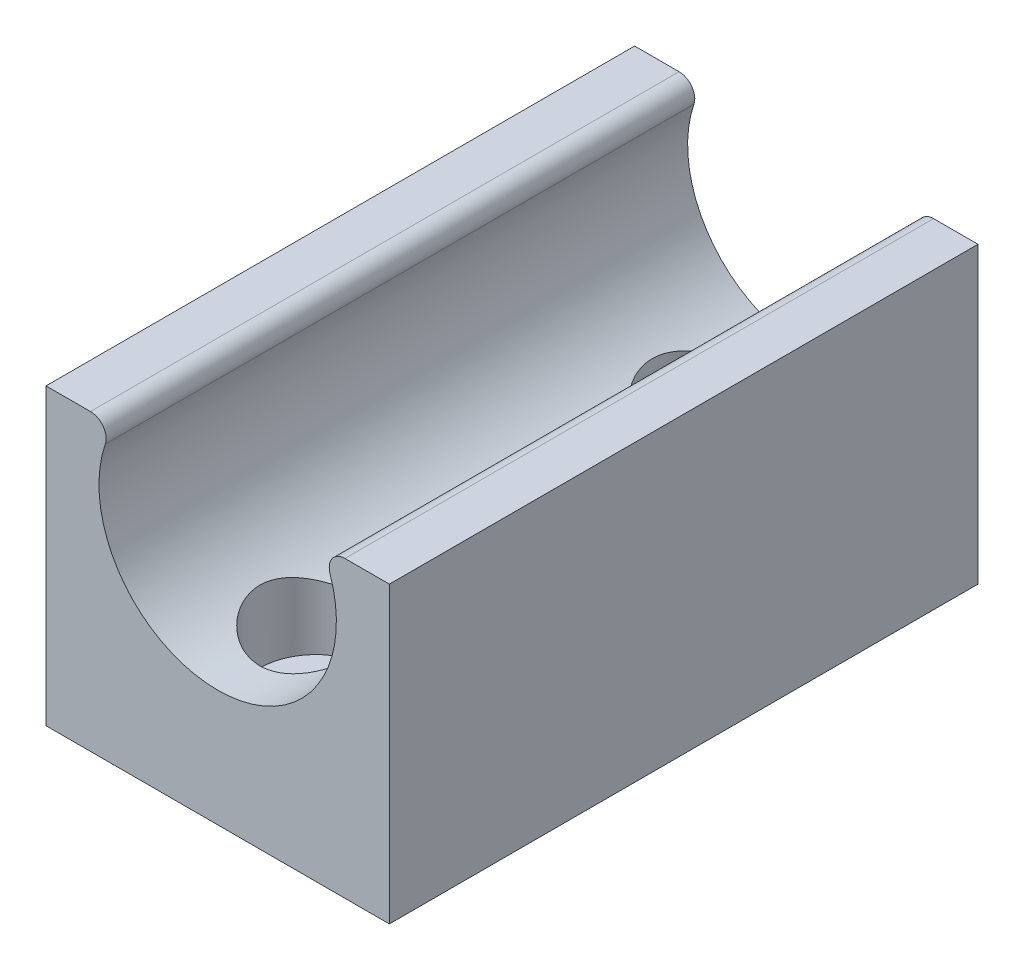
ISO-10303-21;
HEADER;
FILE_DESCRIPTION(('STEP AP214'),'2;1');
FILE_NAME('part.step','',(''),(''),'','','');
FILE_SCHEMA(('AUTOMOTIVE_DESIGN { 1 0 10303 214 1 1 1 1 }'));
ENDSEC;
DATA;
#1=APPLICATION_CONTEXT('core data for automotive mechanical design processes');
#2=APPLICATION_PROTOCOL_DEFINITION('international standard','automotive_design',2000,#1);
#3=PRODUCT_CONTEXT('',#1,'mechanical');
#4=PRODUCT('Part','Part','',(#3));
#5=PRODUCT_RELATED_PRODUCT_CATEGORY('part','',(#4));
#6=PRODUCT_DEFINITION_FORMATION('','',#4);
#7=PRODUCT_DEFINITION_CONTEXT('part definition',#1,'design');
#8=PRODUCT_DEFINITION('design','',#6,#7);
#9=PRODUCT_DEFINITION_SHAPE('','',#8);
#10=(LENGTH_UNIT() NAMED_UNIT(*) SI_UNIT(.MILLI.,.METRE.));
#11=(NAMED_UNIT(*) PLANE_ANGLE_UNIT() SI_UNIT($,.RADIAN.));
#12=(NAMED_UNIT(*) SI_UNIT($,.STERADIAN.) SOLID_ANGLE_UNIT());
#13=UNCERTAINTY_MEASURE_WITH_UNIT(LENGTH_MEASURE(1.E-05),#10,'distance_accuracy_value','');
#14=(GEOMETRIC_REPRESENTATION_CONTEXT(3) GLOBAL_UNCERTAINTY_ASSIGNED_CONTEXT((#13)) GLOBAL_UNIT_ASSIGNED_CONTEXT((#10,
#11,#12)) REPRESENTATION_CONTEXT('',''));
#15=CARTESIAN_POINT('',(0.,0.,0.));
#16=DIRECTION('',(0.,0.,1.));
#17=DIRECTION('',(1.,0.,0.));
#18=AXIS2_PLACEMENT_3D('',#15,#16,#17);
#19=CARTESIAN_POINT('',(-8.75,-7.5,30.));
#20=DIRECTION('',(1.,0.,0.));
#21=DIRECTION('',(0.,0.,-1.));
#22=AXIS2_PLACEMENT_3D('',#19,#20,#21);
#23=PLANE('',#22);
#24=DIRECTION('',(0.,-1.,0.));
#25=VECTOR('',#24,1.);
#26=CARTESIAN_POINT('',(-8.75,-7.5,0.));
#27=LINE('',#26,#25);
#28=CARTESIAN_POINT('',(-8.75,7.5,0.));
#29=VERTEX_POINT('',#28);
#30=CARTESIAN_POINT('',(-8.75,-7.5,0.));
#31=VERTEX_POINT('',#30);
#32=EDGE_CURVE('E128',#29,#31,#27,.T.);
#33=ORIENTED_EDGE('',*,*,#32,.T.);
#34=DIRECTION('',(0.,0.,-1.));
#35=VECTOR('',#34,1.);
#36=CARTESIAN_POINT('',(-8.75,-7.5,30.));
#37=LINE('',#36,#35);
#38=CARTESIAN_POINT('',(-8.75,-7.5,30.));
#39=VERTEX_POINT('',#38);
#40=EDGE_CURVE('E111',#39,#31,#37,.T.);
#41=ORIENTED_EDGE('',*,*,#40,.F.);
#42=DIRECTION('',(0.,-1.,0.));
#43=VECTOR('',#42,1.);
#44=CARTESIAN_POINT('',(-8.75,-7.5,30.));
#45=LINE('',#44,#43);
#46=CARTESIAN_POINT('',(-8.75,7.5,30.));
#47=VERTEX_POINT('',#46);
#48=EDGE_CURVE('E117',#47,#39,#45,.T.);
#49=ORIENTED_EDGE('',*,*,#48,.F.);
#50=DIRECTION('',(0.,0.,-1.));
#51=VECTOR('',#50,1.);
#52=CARTESIAN_POINT('',(-8.75,7.5,30.));
#53=LINE('',#52,#51);
#54=EDGE_CURVE('E208',#47,#29,#53,.T.);
#55=ORIENTED_EDGE('',*,*,#54,.T.);
#56=EDGE_LOOP('',(#33,#41,#49,#55));
#57=FACE_BOUND('',#56,.T.);
#58=ADVANCED_FACE('F37',(#57),#23,.F.);
#59=CARTESIAN_POINT('',(8.75,-7.5,30.));
#60=DIRECTION('',(0.,1.,0.));
#61=DIRECTION('',(-1.,0.,0.));
#62=AXIS2_PLACEMENT_3D('',#59,#60,#61);
#63=PLANE('',#62);
#64=CARTESIAN_POINT('',(0.,-7.5,5.));
#65=DIRECTION('',(0.,1.,0.));
#66=DIRECTION('',(-1.,0.,0.));
#67=AXIS2_PLACEMENT_3D('',#64,#65,#66);
#68=CIRCLE('',#67,1.55);
#69=CARTESIAN_POINT('',(-1.55,-7.5,5.));
#70=VERTEX_POINT('',#69);
#71=EDGE_CURVE('E239',#70,#70,#68,.T.);
#72=ORIENTED_EDGE('',*,*,#71,.T.);
#73=EDGE_LOOP('',(#72));
#74=FACE_BOUND('',#73,.T.);
#75=CARTESIAN_POINT('',(0.,-7.5,25.));
#76=DIRECTION('',(0.,1.,0.));
#77=DIRECTION('',(-1.,0.,0.));
#78=AXIS2_PLACEMENT_3D('',#75,#76,#77);
#79=CIRCLE('',#78,1.55);
#80=CARTESIAN_POINT('',(-1.55,-7.5,25.));
#81=VERTEX_POINT('',#80);
#82=EDGE_CURVE('E236',#81,#81,#79,.T.);
#83=ORIENTED_EDGE('',*,*,#82,.T.);
#84=EDGE_LOOP('',(#83));
#85=FACE_BOUND('',#84,.T.);
#86=DIRECTION('',(1.,0.,0.));
#87=VECTOR('',#86,1.);
#88=CARTESIAN_POINT('',(8.75,-7.5,0.));
#89=LINE('',#88,#87);
#90=CARTESIAN_POINT('',(8.75,-7.5,0.));
#91=VERTEX_POINT('',#90);
#92=EDGE_CURVE('E214',#31,#91,#89,.T.);
#93=ORIENTED_EDGE('',*,*,#92,.T.);
#94=DIRECTION('',(0.,0.,-1.));
#95=VECTOR('',#94,1.);
#96=CARTESIAN_POINT('',(8.75,-7.5,30.));
#97=LINE('',#96,#95);
#98=CARTESIAN_POINT('',(8.75,-7.5,30.));
#99=VERTEX_POINT('',#98);
#100=EDGE_CURVE('E114',#99,#91,#97,.T.);
#101=ORIENTED_EDGE('',*,*,#100,.F.);
#102=DIRECTION('',(1.,0.,0.));
#103=VECTOR('',#102,1.);
#104=CARTESIAN_POINT('',(8.75,-7.5,30.));
#105=LINE('',#104,#103);
#106=EDGE_CURVE('E107',#39,#99,#105,.T.);
#107=ORIENTED_EDGE('',*,*,#106,.F.);
#108=ORIENTED_EDGE('',*,*,#40,.T.);
#109=EDGE_LOOP('',(#93,#101,#107,#108));
#110=FACE_BOUND('',#109,.T.);
#111=ADVANCED_FACE('F109',(#74,#85,#110),#63,.F.);
#112=CARTESIAN_POINT('',(8.75,-7.5,30.));
#113=DIRECTION('',(-1.,0.,0.));
#114=DIRECTION('',(0.,0.,1.));
#115=AXIS2_PLACEMENT_3D('',#112,#113,#114);
#116=PLANE('',#115);
#117=DIRECTION('',(0.,1.,0.));
#118=VECTOR('',#117,1.);
#119=CARTESIAN_POINT('',(8.75,-7.5,0.));
#120=LINE('',#119,#118);
#121=CARTESIAN_POINT('',(8.75,7.5,0.));
#122=VERTEX_POINT('',#121);
#123=EDGE_CURVE('E216',#91,#122,#120,.T.);
#124=ORIENTED_EDGE('',*,*,#123,.T.);
#125=DIRECTION('',(0.,0.,-1.));
#126=VECTOR('',#125,1.);
#127=CARTESIAN_POINT('',(8.75,7.5,30.));
#128=LINE('',#127,#126);
#129=CARTESIAN_POINT('',(8.75,7.5,30.));
#130=VERTEX_POINT('',#129);
#131=EDGE_CURVE('E133',#130,#122,#128,.T.);
#132=ORIENTED_EDGE('',*,*,#131,.F.);
#133=DIRECTION('',(0.,1.,0.));
#134=VECTOR('',#133,1.);
#135=CARTESIAN_POINT('',(8.75,-7.5,30.));
#136=LINE('',#135,#134);
#137=EDGE_CURVE('E116',#99,#130,#136,.T.);
#138=ORIENTED_EDGE('',*,*,#137,.F.);
#139=ORIENTED_EDGE('',*,*,#100,.T.);
#140=EDGE_LOOP('',(#124,#132,#138,#139));
#141=FACE_BOUND('',#140,.T.);
#142=ADVANCED_FACE('F188',(#141),#116,.F.);
#143=CARTESIAN_POINT('',(8.75,7.5,30.));
#144=DIRECTION('',(0.,-1.,0.));
#145=DIRECTION('',(1.,0.,0.));
#146=AXIS2_PLACEMENT_3D('',#143,#144,#145);
#147=PLANE('',#146);
#148=DIRECTION('',(-1.,0.,0.));
#149=VECTOR('',#148,1.);
#150=CARTESIAN_POINT('',(8.75,7.5,0.));
#151=LINE('',#150,#149);
#152=CARTESIAN_POINT('',(6.48484038670802,7.5,0.));
#153=VERTEX_POINT('',#152);
#154=EDGE_CURVE('E218',#122,#153,#151,.T.);
#155=ORIENTED_EDGE('',*,*,#154,.T.);
#156=DIRECTION('',(0.,0.,-1.));
#157=VECTOR('',#156,1.);
#158=CARTESIAN_POINT('',(6.48484038670802,7.5,30.));
#159=LINE('',#158,#157);
#160=CARTESIAN_POINT('',(6.48484038670802,7.5,30.));
#161=VERTEX_POINT('',#160);
#162=EDGE_CURVE('E62',#153,#161,#159,.F.);
#163=ORIENTED_EDGE('',*,*,#162,.T.);
#164=DIRECTION('',(-1.,0.,0.));
#165=VECTOR('',#164,1.);
#166=CARTESIAN_POINT('',(8.75,7.5,30.));
#167=LINE('',#166,#165);
#168=EDGE_CURVE('E202',#130,#161,#167,.T.);
#169=ORIENTED_EDGE('',*,*,#168,.F.);
#170=ORIENTED_EDGE('',*,*,#131,.T.);
#171=EDGE_LOOP('',(#155,#163,#169,#170));
#172=FACE_BOUND('',#171,.T.);
#173=ADVANCED_FACE('F181',(#172),#147,.F.);
#174=CARTESIAN_POINT('',(0.,4.49334072432542,30.));
#175=DIRECTION('',(0.,0.,-1.));
#176=DIRECTION('',(-1.,0.,0.));
#177=AXIS2_PLACEMENT_3D('',#174,#175,#176);
#178=CYLINDRICAL_SURFACE('',#177,6.05);
#179=CARTESIAN_POINT('',(-2.85,-0.843324901325112,5.));
#180=CARTESIAN_POINT('',(-2.8499989882246,-0.843325962160141,4.92506284617702));
#181=CARTESIAN_POINT('',(-2.84703824915715,-0.844910560400331,4.85010864549271));
#182=CARTESIAN_POINT('',(-2.83524134236429,-0.851183783662474,4.70078261634824));
#183=CARTESIAN_POINT('',(-2.82640195806922,-0.855874108012762,4.62641112927954));
#184=CARTESIAN_POINT('',(-2.79115721855613,-0.87440589974426,4.40478428421226));
#185=CARTESIAN_POINT('',(-2.7560255603776,-0.892707670203901,4.2591801308735));
#186=CARTESIAN_POINT('',(-2.66434518317199,-0.938632029821187,3.97741948902311));
#187=CARTESIAN_POINT('',(-2.60790039417588,-0.966209318249675,3.84122088854181));
#188=CARTESIAN_POINT('',(-2.47551043442414,-1.02749785776277,3.58022634918421));
#189=CARTESIAN_POINT('',(-2.39956618779949,-1.06120881813436,3.45542987031108));
#190=CARTESIAN_POINT('',(-2.22383998997592,-1.13397707231557,3.21076931345975));
#191=CARTESIAN_POINT('',(-2.12272545125425,-1.17324490603177,3.09192516441326));
#192=CARTESIAN_POINT('',(-1.90231017821187,-1.25099333576021,2.87210058036671));
#193=CARTESIAN_POINT('',(-1.78300124215914,-1.28947356781704,2.77112824626022));
#194=CARTESIAN_POINT('',(-1.52108381560419,-1.36399437145031,2.58418634874715));
#195=CARTESIAN_POINT('',(-1.37752347972905,-1.39976265761757,2.4994317916005));
#196=CARTESIAN_POINT('',(-1.07618471638381,-1.46215564887553,2.35573428138864));
#197=CARTESIAN_POINT('',(-0.918414337134263,-1.488785489155,2.29677682695535));
#198=CARTESIAN_POINT('',(-0.603899231777868,-1.52839378643805,2.21025684146841));
#199=CARTESIAN_POINT('',(-0.44774205012503,-1.54214055997695,2.18091790097059));
#200=CARTESIAN_POINT('',(-0.132160213250899,-1.55727386291002,2.14865765289242));
#201=CARTESIAN_POINT('',(0.0272626690123537,-1.55866692977895,2.1457223727115));
#202=CARTESIAN_POINT('',(0.331658884616127,-1.54933300640485,2.16557640836186));
#203=CARTESIAN_POINT('',(0.476795516813527,-1.53953580029624,2.18639214596244));
#204=CARTESIAN_POINT('',(0.761231271600467,-1.51028098242694,2.249680313879));
#205=CARTESIAN_POINT('',(0.900529959543285,-1.49082265275679,2.2921543536104));
#206=CARTESIAN_POINT('',(1.1718815649412,-1.44370033258953,2.397938356188));
#207=CARTESIAN_POINT('',(1.30379658061348,-1.41591905821339,2.46154764957289));
#208=CARTESIAN_POINT('',(1.55541862788118,-1.35473288173615,2.60743943153363));
#209=CARTESIAN_POINT('',(1.67512116361969,-1.32132592052589,2.68972876121268));
#210=CARTESIAN_POINT('',(1.90992983015326,-1.24870118827781,2.87884203162927));
#211=CARTESIAN_POINT('',(2.02374731526122,-1.20923074822384,2.98717063550489));
#212=CARTESIAN_POINT('',(2.23224904456479,-1.13089207608264,3.22119449184318));
#213=CARTESIAN_POINT('',(2.32692140784639,-1.09202423167716,3.34690044723529));
#214=CARTESIAN_POINT('',(2.49915362146297,-1.01719552038343,3.62010372745457));
#215=CARTESIAN_POINT('',(2.57558315853621,-0.981486916157376,3.76838921984578));
#216=CARTESIAN_POINT('',(2.70184083363518,-0.920302415458159,4.07782431993801));
#217=CARTESIAN_POINT('',(2.75169387338404,-0.89481694564636,4.2389617222575));
#218=CARTESIAN_POINT('',(2.81962549886371,-0.859563311009935,4.55664490993834));
#219=CARTESIAN_POINT('',(2.83981792555294,-0.848754230952234,4.71261961652321));
#220=CARTESIAN_POINT('',(2.85418916232023,-0.841093871675167,5.0260696136691));
#221=CARTESIAN_POINT('',(2.84838214164289,-0.844234989833963,5.18354404022352));
#222=CARTESIAN_POINT('',(2.81285785211773,-0.863024601351508,5.48020272094081));
#223=CARTESIAN_POINT('',(2.7853805966085,-0.877500481685122,5.61974058646098));
#224=CARTESIAN_POINT('',(2.71048888723461,-0.915679786178811,5.89201952098831));
#225=CARTESIAN_POINT('',(2.6630687775436,-0.939385827886286,6.02475864987333));
#226=CARTESIAN_POINT('',(2.54728029250771,-0.994659301545963,6.28658408179406));
#227=CARTESIAN_POINT('',(2.47804639900787,-1.02653896212907,6.41521933400834));
#228=CARTESIAN_POINT('',(2.32138359490987,-1.09423076977478,6.65975574780989));
#229=CARTESIAN_POINT('',(2.23394562838507,-1.1300448698871,6.77565052741806));
#230=CARTESIAN_POINT('',(2.03215917989973,-1.20627991733239,7.00464015324657));
#231=CARTESIAN_POINT('',(1.9159144413754,-1.24677674084127,7.11604618294584));
#232=CARTESIAN_POINT('',(1.66560725137788,-1.32434014608883,7.31821839691486));
#233=CARTESIAN_POINT('',(1.53154080121126,-1.36140595482843,7.40897993671202));
#234=CARTESIAN_POINT('',(1.24622291956637,-1.42875568632497,7.56837224851893));
#235=CARTESIAN_POINT('',(1.09473034998106,-1.45892130127908,7.63662472315287));
#236=CARTESIAN_POINT('',(0.780591848647872,-1.50819023709147,7.74604810098079));
#237=CARTESIAN_POINT('',(0.617954698333516,-1.52730215816969,7.78724006174593));
#238=CARTESIAN_POINT('',(0.301007405354584,-1.55107757021599,7.83821167670355));
#239=CARTESIAN_POINT('',(0.147157370848674,-1.55682693429532,7.85035469856508));
#240=CARTESIAN_POINT('',(-0.160449912685097,-1.55648431631636,7.849629803028));
#241=CARTESIAN_POINT('',(-0.314207175601912,-1.55039560179367,7.83676878722098));
#242=CARTESIAN_POINT('',(-0.608567397357767,-1.5276877484004,7.78804703159201));
#243=CARTESIAN_POINT('',(-0.749432089648062,-1.51165579172214,7.75346748990454));
#244=CARTESIAN_POINT('',(-1.0231967707405,-1.47111499977176,7.66389228463917));
#245=CARTESIAN_POINT('',(-1.1560954816221,-1.44660480864984,7.60889335546421));
#246=CARTESIAN_POINT('',(-1.41683847367169,-1.38999782743283,7.47736786998933));
#247=CARTESIAN_POINT('',(-1.54418370017449,-1.35760848897753,7.39998152570816));
#248=CARTESIAN_POINT('',(-1.78463848091361,-1.28880693776256,7.22699836414413));
#249=CARTESIAN_POINT('',(-1.89774154565794,-1.25239290522466,7.13139329494248));
#250=CARTESIAN_POINT('',(-2.11705162987706,-1.17545734008284,6.91479137367063));
#251=CARTESIAN_POINT('',(-2.22174954783971,-1.13485862846192,6.79229210676277));
#252=CARTESIAN_POINT('',(-2.4095736670888,-1.05704862284719,6.53048462758407));
#253=CARTESIAN_POINT('',(-2.49268415691624,-1.01983980875711,6.39116428025324));
#254=CARTESIAN_POINT('',(-2.59966359265012,-0.969793199839931,6.17093003039283));
#255=CARTESIAN_POINT('',(-2.63257158273468,-0.953966202220585,6.09496874071065));
#256=CARTESIAN_POINT('',(-2.69178141129205,-0.924952433614585,5.94004113791185));
#257=CARTESIAN_POINT('',(-2.71808661076647,-0.911764320059814,5.8610763773134));
#258=CARTESIAN_POINT('',(-2.76371403261851,-0.888577069134856,5.70092930054108));
#259=CARTESIAN_POINT('',(-2.78305446261832,-0.878569624883309,5.6197533720948));
#260=CARTESIAN_POINT('',(-2.81456857001194,-0.862125883871914,5.45570764345971));
#261=CARTESIAN_POINT('',(-2.82674745584598,-0.855686991975566,5.37283911976006));
#262=CARTESIAN_POINT('',(-2.84016317974242,-0.84856909907034,5.24147121527024));
#263=CARTESIAN_POINT('',(-2.84384961677823,-0.846605637321501,5.19327643708297));
#264=CARTESIAN_POINT('',(-2.8487684144211,-0.843983163682739,5.09672347825661));
#265=CARTESIAN_POINT('',(-2.85000065301133,-0.843324216650144,5.04836528961288));
#266=CARTESIAN_POINT('',(-2.85,-0.843324901325112,5.));
#267=B_SPLINE_CURVE_WITH_KNOTS('',3,(#179,#180,#181,#182,#183,#184,#185,#186,#187,#188,#189,
#190,#191,#192,#193,#194,#195,#196,#197,#198,#199,#200,#201,#202,#203,#204,#205,#206,#207,#208,
#209,#210,#211,#212,#213,#214,#215,#216,#217,#218,#219,#220,#221,#222,#223,#224,#225,#226,#227,
#228,#229,#230,#231,#232,#233,#234,#235,#236,#237,#238,#239,#240,#241,#242,#243,#244,#245,#246,
#247,#248,#249,#250,#251,#252,#253,#254,#255,#256,#257,#258,#259,#260,#261,#262,#263,#264,#265,
#266),.UNSPECIFIED.,.T.,.F.,(4,2,2,2,2,2,2,2,2,2,2,2,2,2,2,2,2,2,2,2,2,2,2,2,2,2,2,2,2,2,2,2,2,
2,2,2,2,2,2,2,2,2,2,4),(0.,0.224758209479904,0.449639499339931,0.899886009747312,
1.3479647408534,1.79602224023943,2.27668763370605,2.75757034715989,3.26643733370381,
3.77501790135813,4.25086523434136,4.72646073799329,5.16524366175034,5.60405919595548,
6.04937508116818,6.49485431621642,6.97878667293112,7.46301842879523,7.97215069028672,
8.48080506133897,8.95107607118861,9.42109082275927,9.84803132451671,10.2750929890426,
10.7218571613219,11.1688441173987,11.664658905378,12.1605851286873,12.664465386516,
13.1679530759451,13.6288312048903,14.0895821407363,14.5254202160045,14.9613280232885,
15.4169152827735,15.8727093867757,16.3690601282415,16.8657711108777,17.1183268255345,
17.3707537204981,17.62251583496,17.8740946209507,18.0191489087825,18.164210408183),.UNSPECIFIED.);
#268=CARTESIAN_POINT('',(-2.85,-0.843324901325112,5.));
#269=VERTEX_POINT('',#268);
#270=EDGE_CURVE('E153',#269,#269,#267,.T.);
#271=ORIENTED_EDGE('',*,*,#270,.T.);
#272=EDGE_LOOP('',(#271));
#273=FACE_BOUND('',#272,.T.);
#274=CARTESIAN_POINT('',(-2.85,-0.843324901325111,25.));
#275=CARTESIAN_POINT('',(-2.8499989882246,-0.84332596216014,24.925062846177));
#276=CARTESIAN_POINT('',(-2.84703824915715,-0.844910560400329,24.8501086454927));
#277=CARTESIAN_POINT('',(-2.83524134236429,-0.851183783662472,24.7007826163482));
#278=CARTESIAN_POINT('',(-2.82640195806922,-0.855874108012761,24.6264111292795));
#279=CARTESIAN_POINT('',(-2.79115721855613,-0.874405899744261,24.4047842842123));
#280=CARTESIAN_POINT('',(-2.7560255603776,-0.8927076702039,24.2591801308735));
#281=CARTESIAN_POINT('',(-2.66434518317199,-0.938632029821186,23.9774194890231));
#282=CARTESIAN_POINT('',(-2.60790039417588,-0.966209318249674,23.8412208885418));
#283=CARTESIAN_POINT('',(-2.47551043442414,-1.02749785776277,23.5802263491842));
#284=CARTESIAN_POINT('',(-2.39956618779949,-1.06120881813436,23.4554298703111));
#285=CARTESIAN_POINT('',(-2.22383998997592,-1.13397707231557,23.2107693134597));
#286=CARTESIAN_POINT('',(-2.12272545125425,-1.17324490603177,23.0919251644133));
#287=CARTESIAN_POINT('',(-1.90231017821187,-1.25099333576021,22.8721005803667));
#288=CARTESIAN_POINT('',(-1.78300124215914,-1.28947356781704,22.7711282462602));
#289=CARTESIAN_POINT('',(-1.52108381560419,-1.36399437145031,22.5841863487471));
#290=CARTESIAN_POINT('',(-1.37752347972905,-1.39976265761757,22.4994317916005));
#291=CARTESIAN_POINT('',(-1.07618471638381,-1.46215564887552,22.3557342813886));
#292=CARTESIAN_POINT('',(-0.918414337134264,-1.488785489155,22.2967768269553));
#293=CARTESIAN_POINT('',(-0.603899231777868,-1.52839378643805,22.2102568414684));
#294=CARTESIAN_POINT('',(-0.44774205012503,-1.54214055997695,22.1809179009706));
#295=CARTESIAN_POINT('',(-0.1321602132509,-1.55727386291002,22.1486576528924));
#296=CARTESIAN_POINT('',(0.0272626690123531,-1.55866692977895,22.1457223727115));
#297=CARTESIAN_POINT('',(0.331658884616126,-1.54933300640485,22.1655764083619));
#298=CARTESIAN_POINT('',(0.476795516813526,-1.53953580029624,22.1863921459624));
#299=CARTESIAN_POINT('',(0.761231271600467,-1.51028098242694,22.249680313879));
#300=CARTESIAN_POINT('',(0.900529959543285,-1.49082265275679,22.2921543536104));
#301=CARTESIAN_POINT('',(1.1718815649412,-1.44370033258953,22.397938356188));
#302=CARTESIAN_POINT('',(1.30379658061349,-1.41591905821339,22.4615476495729));
#303=CARTESIAN_POINT('',(1.55541862788118,-1.35473288173615,22.6074394315336));
#304=CARTESIAN_POINT('',(1.67512116361969,-1.32132592052589,22.6897287612127));
#305=CARTESIAN_POINT('',(1.90992983015326,-1.24870118827781,22.8788420316293));
#306=CARTESIAN_POINT('',(2.02374731526122,-1.20923074822384,22.9871706355049));
#307=CARTESIAN_POINT('',(2.23224904456479,-1.13089207608264,23.2211944918432));
#308=CARTESIAN_POINT('',(2.32692140784639,-1.09202423167716,23.3469004472353));
#309=CARTESIAN_POINT('',(2.49915362146297,-1.01719552038343,23.6201037274546));
#310=CARTESIAN_POINT('',(2.57558315853621,-0.981486916157375,23.7683892198458));
#311=CARTESIAN_POINT('',(2.70184083363519,-0.920302415458157,24.077824319938));
#312=CARTESIAN_POINT('',(2.75169387338404,-0.89481694564636,24.2389617222575));
#313=CARTESIAN_POINT('',(2.81962549886371,-0.859563311009935,24.5566449099383));
#314=CARTESIAN_POINT('',(2.83981792555294,-0.848754230952233,24.7126196165232));
#315=CARTESIAN_POINT('',(2.85418916232023,-0.841093871675165,25.0260696136691));
#316=CARTESIAN_POINT('',(2.84838214164289,-0.844234989833961,25.1835440402235));
#317=CARTESIAN_POINT('',(2.81285785211773,-0.863024601351507,25.4802027209408));
#318=CARTESIAN_POINT('',(2.7853805966085,-0.877500481685122,25.619740586461));
#319=CARTESIAN_POINT('',(2.71048888723461,-0.915679786178811,25.8920195209883));
#320=CARTESIAN_POINT('',(2.6630687775436,-0.939385827886285,26.0247586498733));
#321=CARTESIAN_POINT('',(2.54728029250771,-0.994659301545962,26.2865840817941));
#322=CARTESIAN_POINT('',(2.47804639900787,-1.02653896212907,26.4152193340083));
#323=CARTESIAN_POINT('',(2.32138359490987,-1.09423076977478,26.6597557478099));
#324=CARTESIAN_POINT('',(2.23394562838507,-1.1300448698871,26.7756505274181));
#325=CARTESIAN_POINT('',(2.03215917989973,-1.20627991733239,27.0046401532466));
#326=CARTESIAN_POINT('',(1.9159144413754,-1.24677674084127,27.1160461829458));
#327=CARTESIAN_POINT('',(1.66560725137788,-1.32434014608883,27.3182183969149));
#328=CARTESIAN_POINT('',(1.53154080121126,-1.36140595482843,27.408979936712));
#329=CARTESIAN_POINT('',(1.24622291956637,-1.42875568632497,27.5683722485189));
#330=CARTESIAN_POINT('',(1.09473034998106,-1.45892130127908,27.6366247231529));
#331=CARTESIAN_POINT('',(0.780591848647874,-1.50819023709147,27.7460481009808));
#332=CARTESIAN_POINT('',(0.617954698333519,-1.52730215816969,27.7872400617459));
#333=CARTESIAN_POINT('',(0.301007405354588,-1.55107757021599,27.8382116767035));
#334=CARTESIAN_POINT('',(0.147157370848679,-1.55682693429532,27.8503546985651));
#335=CARTESIAN_POINT('',(-0.160449912685093,-1.55648431631636,27.849629803028));
#336=CARTESIAN_POINT('',(-0.314207175601909,-1.55039560179367,27.836768787221));
#337=CARTESIAN_POINT('',(-0.608567397357764,-1.5276877484004,27.788047031592));
#338=CARTESIAN_POINT('',(-0.749432089648059,-1.51165579172214,27.7534674899045));
#339=CARTESIAN_POINT('',(-1.0231967707405,-1.47111499977176,27.6638922846392));
#340=CARTESIAN_POINT('',(-1.1560954816221,-1.44660480864984,27.6088933554642));
#341=CARTESIAN_POINT('',(-1.41683847367169,-1.38999782743283,27.4773678699893));
#342=CARTESIAN_POINT('',(-1.54418370017449,-1.35760848897753,27.3999815257082));
#343=CARTESIAN_POINT('',(-1.78463848091361,-1.28880693776256,27.2269983641441));
#344=CARTESIAN_POINT('',(-1.89774154565793,-1.25239290522466,27.1313932949425));
#345=CARTESIAN_POINT('',(-2.11705162987706,-1.17545734008284,26.9147913736706));
#346=CARTESIAN_POINT('',(-2.22174954783971,-1.13485862846192,26.7922921067628));
#347=CARTESIAN_POINT('',(-2.4095736670888,-1.05704862284719,26.5304846275841));
#348=CARTESIAN_POINT('',(-2.49268415691624,-1.01983980875711,26.3911642802532));
#349=CARTESIAN_POINT('',(-2.59966359265011,-0.969793199839932,26.1709300303928));
#350=CARTESIAN_POINT('',(-2.63257158273467,-0.953966202220586,26.0949687407107));
#351=CARTESIAN_POINT('',(-2.69178141129205,-0.924952433614586,25.9400411379119));
#352=CARTESIAN_POINT('',(-2.71808661076647,-0.911764320059814,25.8610763773134));
#353=CARTESIAN_POINT('',(-2.76371403261851,-0.888577069134855,25.7009293005411));
#354=CARTESIAN_POINT('',(-2.78305446261832,-0.878569624883308,25.6197533720948));
#355=CARTESIAN_POINT('',(-2.81456857001194,-0.862125883871914,25.4557076434597));
#356=CARTESIAN_POINT('',(-2.82674745584598,-0.855686991975566,25.3728391197601));
#357=CARTESIAN_POINT('',(-2.84016317974242,-0.848569099070339,25.2414712152702));
#358=CARTESIAN_POINT('',(-2.84384961677823,-0.8466056373215,25.193276437083));
#359=CARTESIAN_POINT('',(-2.8487684144211,-0.843983163682738,25.0967234782566));
#360=CARTESIAN_POINT('',(-2.85000065301133,-0.843324216650143,25.0483652896129));
#361=CARTESIAN_POINT('',(-2.85,-0.843324901325111,25.));
#362=B_SPLINE_CURVE_WITH_KNOTS('',3,(#274,#275,#276,#277,#278,#279,#280,#281,#282,#283,#284,
#285,#286,#287,#288,#289,#290,#291,#292,#293,#294,#295,#296,#297,#298,#299,#300,#301,#302,#303,
#304,#305,#306,#307,#308,#309,#310,#311,#312,#313,#314,#315,#316,#317,#318,#319,#320,#321,#322,
#323,#324,#325,#326,#327,#328,#329,#330,#331,#332,#333,#334,#335,#336,#337,#338,#339,#340,#341,
#342,#343,#344,#345,#346,#347,#348,#349,#350,#351,#352,#353,#354,#355,#356,#357,#358,#359,#360,
#361),.UNSPECIFIED.,.T.,.F.,(4,2,2,2,2,2,2,2,2,2,2,2,2,2,2,2,2,2,2,2,2,2,2,2,2,2,2,2,2,2,2,2,2,
2,2,2,2,2,2,2,2,2,2,4),(0.,0.224758209479907,0.449639499339934,0.899886009747312,
1.34796474085341,1.79602224023944,2.27668763370605,2.75757034715989,3.26643733370382,
3.77501790135814,4.25086523434137,4.72646073799329,5.16524366175034,5.60405919595548,
6.04937508116818,6.49485431621643,6.97878667293113,7.46301842879523,7.97215069028672,
8.48080506133897,8.9510760711886,9.42109082275927,9.84803132451671,10.2750929890426,
10.7218571613219,11.1688441173987,11.664658905378,12.1605851286873,12.664465386516,
13.1679530759451,13.6288312048903,14.0895821407364,14.5254202160045,14.9613280232885,
15.4169152827735,15.8727093867757,16.3690601282415,16.8657711108777,17.1183268255345,
17.3707537204981,17.62251583496,17.8740946209507,18.0191489087825,18.164210408183),.UNSPECIFIED.);
#363=CARTESIAN_POINT('',(-2.85,-0.843324901325111,25.));
#364=VERTEX_POINT('',#363);
#365=EDGE_CURVE('E146',#364,#364,#362,.T.);
#366=ORIENTED_EDGE('',*,*,#365,.T.);
#367=EDGE_LOOP('',(#366));
#368=FACE_BOUND('',#367,.T.);
#369=CARTESIAN_POINT('',(0.,4.49334072432542,30.));
#370=DIRECTION('',(0.,0.,-1.));
#371=DIRECTION('',(1.,0.,0.));
#372=AXIS2_PLACEMENT_3D('',#369,#370,#371);
#373=CIRCLE('',#372,6.05);
#374=CARTESIAN_POINT('',(5.7274867649027,6.44228796780443,30.));
#375=VERTEX_POINT('',#374);
#376=CARTESIAN_POINT('',(-5.7274867649027,6.44228796780442,30.));
#377=VERTEX_POINT('',#376);
#378=EDGE_CURVE('E201',#375,#377,#373,.T.);
#379=ORIENTED_EDGE('',*,*,#378,.F.);
#380=DIRECTION('',(0.,0.,-1.));
#381=VECTOR('',#380,1.);
#382=CARTESIAN_POINT('',(5.7274867649027,6.44228796780443,30.));
#383=LINE('',#382,#381);
#384=CARTESIAN_POINT('',(5.7274867649027,6.44228796780443,0.));
#385=VERTEX_POINT('',#384);
#386=EDGE_CURVE('E131',#375,#385,#383,.T.);
#387=ORIENTED_EDGE('',*,*,#386,.T.);
#388=CARTESIAN_POINT('',(0.,4.49334072432542,0.));
#389=DIRECTION('',(0.,0.,-1.));
#390=DIRECTION('',(1.,0.,0.));
#391=AXIS2_PLACEMENT_3D('',#388,#389,#390);
#392=CIRCLE('',#391,6.05);
#393=CARTESIAN_POINT('',(-5.7274867649027,6.44228796780442,0.));
#394=VERTEX_POINT('',#393);
#395=EDGE_CURVE('E220',#385,#394,#392,.T.);
#396=ORIENTED_EDGE('',*,*,#395,.T.);
#397=DIRECTION('',(0.,0.,-1.));
#398=VECTOR('',#397,1.);
#399=CARTESIAN_POINT('',(-5.7274867649027,6.44228796780442,30.));
#400=LINE('',#399,#398);
#401=EDGE_CURVE('E129',#394,#377,#400,.F.);
#402=ORIENTED_EDGE('',*,*,#401,.T.);
#403=EDGE_LOOP('',(#379,#387,#396,#402));
#404=FACE_BOUND('',#403,.T.);
#405=ADVANCED_FACE('F158',(#273,#368,#404),#178,.F.);
#406=CARTESIAN_POINT('',(-5.25,7.5,30.));
#407=DIRECTION('',(0.,-1.,0.));
#408=DIRECTION('',(1.,0.,0.));
#409=AXIS2_PLACEMENT_3D('',#406,#407,#408);
#410=PLANE('',#409);
#411=DIRECTION('',(-1.,0.,0.));
#412=VECTOR('',#411,1.);
#413=CARTESIAN_POINT('',(-5.25,7.5,30.));
#414=LINE('',#413,#412);
#415=CARTESIAN_POINT('',(-6.48484038670801,7.5,30.));
#416=VERTEX_POINT('',#415);
#417=EDGE_CURVE('E121',#416,#47,#414,.T.);
#418=ORIENTED_EDGE('',*,*,#417,.F.);
#419=DIRECTION('',(0.,0.,-1.));
#420=VECTOR('',#419,1.);
#421=CARTESIAN_POINT('',(-6.48484038670801,7.5,30.));
#422=LINE('',#421,#420);
#423=CARTESIAN_POINT('',(-6.48484038670801,7.5,0.));
#424=VERTEX_POINT('',#423);
#425=EDGE_CURVE('E11',#416,#424,#422,.T.);
#426=ORIENTED_EDGE('',*,*,#425,.T.);
#427=DIRECTION('',(-1.,0.,0.));
#428=VECTOR('',#427,1.);
#429=CARTESIAN_POINT('',(-5.25,7.5,0.));
#430=LINE('',#429,#428);
#431=EDGE_CURVE('E125',#424,#29,#430,.T.);
#432=ORIENTED_EDGE('',*,*,#431,.T.);
#433=ORIENTED_EDGE('',*,*,#54,.F.);
#434=EDGE_LOOP('',(#418,#426,#432,#433));
#435=FACE_BOUND('',#434,.T.);
#436=ADVANCED_FACE('F172',(#435),#410,.F.);
#437=CARTESIAN_POINT('',(0.,4.49334072432542,30.));
#438=DIRECTION('',(0.,0.,1.));
#439=DIRECTION('',(1.,0.,0.));
#440=AXIS2_PLACEMENT_3D('',#437,#438,#439);
#441=PLANE('',#440);
#442=ORIENTED_EDGE('',*,*,#168,.T.);
#443=CARTESIAN_POINT('',(6.48484038670802,6.7,30.));
#444=DIRECTION('',(0.,0.,1.));
#445=DIRECTION('',(1.,0.,0.));
#446=AXIS2_PLACEMENT_3D('',#443,#444,#445);
#447=CIRCLE('',#446,0.8);
#448=EDGE_CURVE('E46',#161,#375,#447,.T.);
#449=ORIENTED_EDGE('',*,*,#448,.T.);
#450=ORIENTED_EDGE('',*,*,#378,.T.);
#451=CARTESIAN_POINT('',(-6.48484038670801,6.7,30.));
#452=DIRECTION('',(0.,0.,1.));
#453=DIRECTION('',(1.,0.,0.));
#454=AXIS2_PLACEMENT_3D('',#451,#452,#453);
#455=CIRCLE('',#454,0.8);
#456=EDGE_CURVE('E54',#377,#416,#455,.T.);
#457=ORIENTED_EDGE('',*,*,#456,.T.);
#458=ORIENTED_EDGE('',*,*,#417,.T.);
#459=ORIENTED_EDGE('',*,*,#48,.T.);
#460=ORIENTED_EDGE('',*,*,#106,.T.);
#461=ORIENTED_EDGE('',*,*,#137,.T.);
#462=EDGE_LOOP('',(#442,#449,#450,#457,#458,#459,#460,#461));
#463=FACE_BOUND('',#462,.T.);
#464=ADVANCED_FACE('F120',(#463),#441,.T.);
#465=CARTESIAN_POINT('',(0.,4.49334072432542,0.));
#466=DIRECTION('',(0.,0.,1.));
#467=DIRECTION('',(1.,0.,0.));
#468=AXIS2_PLACEMENT_3D('',#465,#466,#467);
#469=PLANE('',#468);
#470=ORIENTED_EDGE('',*,*,#395,.F.);
#471=CARTESIAN_POINT('',(6.48484038670802,6.7,0.));
#472=DIRECTION('',(0.,0.,1.));
#473=DIRECTION('',(1.,0.,0.));
#474=AXIS2_PLACEMENT_3D('',#471,#472,#473);
#475=CIRCLE('',#474,0.8);
#476=EDGE_CURVE('E141',#385,#153,#475,.F.);
#477=ORIENTED_EDGE('',*,*,#476,.T.);
#478=ORIENTED_EDGE('',*,*,#154,.F.);
#479=ORIENTED_EDGE('',*,*,#123,.F.);
#480=ORIENTED_EDGE('',*,*,#92,.F.);
#481=ORIENTED_EDGE('',*,*,#32,.F.);
#482=ORIENTED_EDGE('',*,*,#431,.F.);
#483=CARTESIAN_POINT('',(-6.48484038670801,6.7,0.));
#484=DIRECTION('',(0.,0.,1.));
#485=DIRECTION('',(1.,0.,0.));
#486=AXIS2_PLACEMENT_3D('',#483,#484,#485);
#487=CIRCLE('',#486,0.8);
#488=EDGE_CURVE('E139',#424,#394,#487,.F.);
#489=ORIENTED_EDGE('',*,*,#488,.T.);
#490=EDGE_LOOP('',(#470,#477,#478,#479,#480,#481,#482,#489));
#491=FACE_BOUND('',#490,.T.);
#492=ADVANCED_FACE('F171',(#491),#469,.F.);
#493=CARTESIAN_POINT('',(6.48484038670802,6.7,30.));
#494=DIRECTION('',(0.,0.,-1.));
#495=DIRECTION('',(-1.,0.,0.));
#496=AXIS2_PLACEMENT_3D('',#493,#494,#495);
#497=CYLINDRICAL_SURFACE('',#496,0.8);
#498=ORIENTED_EDGE('',*,*,#448,.F.);
#499=ORIENTED_EDGE('',*,*,#162,.F.);
#500=ORIENTED_EDGE('',*,*,#476,.F.);
#501=ORIENTED_EDGE('',*,*,#386,.F.);
#502=EDGE_LOOP('',(#498,#499,#500,#501));
#503=FACE_BOUND('',#502,.T.);
#504=ADVANCED_FACE('F174',(#503),#497,.T.);
#505=CARTESIAN_POINT('',(-6.48484038670801,6.7,30.));
#506=DIRECTION('',(0.,0.,-1.));
#507=DIRECTION('',(-1.,0.,0.));
#508=AXIS2_PLACEMENT_3D('',#505,#506,#507);
#509=CYLINDRICAL_SURFACE('',#508,0.8);
#510=ORIENTED_EDGE('',*,*,#456,.F.);
#511=ORIENTED_EDGE('',*,*,#401,.F.);
#512=ORIENTED_EDGE('',*,*,#488,.F.);
#513=ORIENTED_EDGE('',*,*,#425,.F.);
#514=EDGE_LOOP('',(#510,#511,#512,#513));
#515=FACE_BOUND('',#514,.T.);
#516=ADVANCED_FACE('F39',(#515),#509,.T.);
#517=CARTESIAN_POINT('',(0.,-4.5,25.));
#518=DIRECTION('',(0.,1.,0.));
#519=DIRECTION('',(-1.,0.,0.));
#520=AXIS2_PLACEMENT_3D('',#517,#518,#519);
#521=CYLINDRICAL_SURFACE('',#520,2.85);
#522=CARTESIAN_POINT('',(0.,-4.5,25.));
#523=DIRECTION('',(0.,1.,0.));
#524=DIRECTION('',(-1.,0.,0.));
#525=AXIS2_PLACEMENT_3D('',#522,#523,#524);
#526=CIRCLE('',#525,2.85);
#527=CARTESIAN_POINT('',(-2.85,-4.5,25.));
#528=VERTEX_POINT('',#527);
#529=EDGE_CURVE('E231',#528,#528,#526,.T.);
#530=ORIENTED_EDGE('',*,*,#529,.F.);
#531=EDGE_LOOP('',(#530));
#532=FACE_BOUND('',#531,.T.);
#533=ORIENTED_EDGE('',*,*,#365,.F.);
#534=EDGE_LOOP('',(#533));
#535=FACE_BOUND('',#534,.T.);
#536=ADVANCED_FACE('F162',(#532,#535),#521,.F.);
#537=CARTESIAN_POINT('',(0.,-4.5,25.));
#538=DIRECTION('',(0.,1.,0.));
#539=DIRECTION('',(-1.,0.,0.));
#540=AXIS2_PLACEMENT_3D('',#537,#538,#539);
#541=PLANE('',#540);
#542=CARTESIAN_POINT('',(0.,-4.5,25.));
#543=DIRECTION('',(0.,1.,0.));
#544=DIRECTION('',(-1.,0.,0.));
#545=AXIS2_PLACEMENT_3D('',#542,#543,#544);
#546=CIRCLE('',#545,1.55);
#547=CARTESIAN_POINT('',(-1.55,-4.5,25.));
#548=VERTEX_POINT('',#547);
#549=EDGE_CURVE('E41',#548,#548,#546,.T.);
#550=ORIENTED_EDGE('',*,*,#549,.F.);
#551=EDGE_LOOP('',(#550));
#552=FACE_BOUND('',#551,.T.);
#553=ORIENTED_EDGE('',*,*,#529,.T.);
#554=EDGE_LOOP('',(#553));
#555=FACE_BOUND('',#554,.T.);
#556=ADVANCED_FACE('F167',(#552,#555),#541,.T.);
#557=CARTESIAN_POINT('',(0.,-4.5,5.));
#558=DIRECTION('',(0.,1.,0.));
#559=DIRECTION('',(-1.,0.,0.));
#560=AXIS2_PLACEMENT_3D('',#557,#558,#559);
#561=CYLINDRICAL_SURFACE('',#560,2.85);
#562=CARTESIAN_POINT('',(0.,-4.5,5.));
#563=DIRECTION('',(0.,1.,0.));
#564=DIRECTION('',(-1.,0.,0.));
#565=AXIS2_PLACEMENT_3D('',#562,#563,#564);
#566=CIRCLE('',#565,2.85);
#567=CARTESIAN_POINT('',(-2.85,-4.5,5.));
#568=VERTEX_POINT('',#567);
#569=EDGE_CURVE('E154',#568,#568,#566,.T.);
#570=ORIENTED_EDGE('',*,*,#569,.F.);
#571=EDGE_LOOP('',(#570));
#572=FACE_BOUND('',#571,.T.);
#573=ORIENTED_EDGE('',*,*,#270,.F.);
#574=EDGE_LOOP('',(#573));
#575=FACE_BOUND('',#574,.T.);
#576=ADVANCED_FACE('F254',(#572,#575),#561,.F.);
#577=CARTESIAN_POINT('',(0.,-4.5,5.));
#578=DIRECTION('',(0.,1.,0.));
#579=DIRECTION('',(-1.,0.,0.));
#580=AXIS2_PLACEMENT_3D('',#577,#578,#579);
#581=PLANE('',#580);
#582=CARTESIAN_POINT('',(0.,-4.5,5.));
#583=DIRECTION('',(0.,1.,0.));
#584=DIRECTION('',(-1.,0.,0.));
#585=AXIS2_PLACEMENT_3D('',#582,#583,#584);
#586=CIRCLE('',#585,1.55);
#587=CARTESIAN_POINT('',(-1.55,-4.5,5.));
#588=VERTEX_POINT('',#587);
#589=EDGE_CURVE('E241',#588,#588,#586,.T.);
#590=ORIENTED_EDGE('',*,*,#589,.F.);
#591=EDGE_LOOP('',(#590));
#592=FACE_BOUND('',#591,.T.);
#593=ORIENTED_EDGE('',*,*,#569,.T.);
#594=EDGE_LOOP('',(#593));
#595=FACE_BOUND('',#594,.T.);
#596=ADVANCED_FACE('F262',(#592,#595),#581,.T.);
#597=CARTESIAN_POINT('',(0.,-7.5,5.));
#598=DIRECTION('',(0.,1.,0.));
#599=DIRECTION('',(-1.,0.,0.));
#600=AXIS2_PLACEMENT_3D('',#597,#598,#599);
#601=CYLINDRICAL_SURFACE('',#600,1.55);
#602=ORIENTED_EDGE('',*,*,#589,.T.);
#603=EDGE_LOOP('',(#602));
#604=FACE_BOUND('',#603,.T.);
#605=ORIENTED_EDGE('',*,*,#71,.F.);
#606=EDGE_LOOP('',(#605));
#607=FACE_BOUND('',#606,.T.);
#608=ADVANCED_FACE('F267',(#604,#607),#601,.F.);
#609=CARTESIAN_POINT('',(0.,-7.5,25.));
#610=DIRECTION('',(0.,1.,0.));
#611=DIRECTION('',(-1.,0.,0.));
#612=AXIS2_PLACEMENT_3D('',#609,#610,#611);
#613=CYLINDRICAL_SURFACE('',#612,1.55);
#614=ORIENTED_EDGE('',*,*,#549,.T.);
#615=EDGE_LOOP('',(#614));
#616=FACE_BOUND('',#615,.T.);
#617=ORIENTED_EDGE('',*,*,#82,.F.);
#618=EDGE_LOOP('',(#617));
#619=FACE_BOUND('',#618,.T.);
#620=ADVANCED_FACE('F249',(#616,#619),#613,.F.);
#621=CLOSED_SHELL('',(#58,#111,#142,#173,#405,#436,#464,#492,#504,#516,#536,#556,#576,#596,#608,#620));
#622=MANIFOLD_SOLID_BREP('B2',#621);
#623=ADVANCED_BREP_SHAPE_REPRESENTATION('',(#18,#622),#14);
#624=SHAPE_DEFINITION_REPRESENTATION(#9,#623);
ENDSEC;
END-ISO-10303-21;
